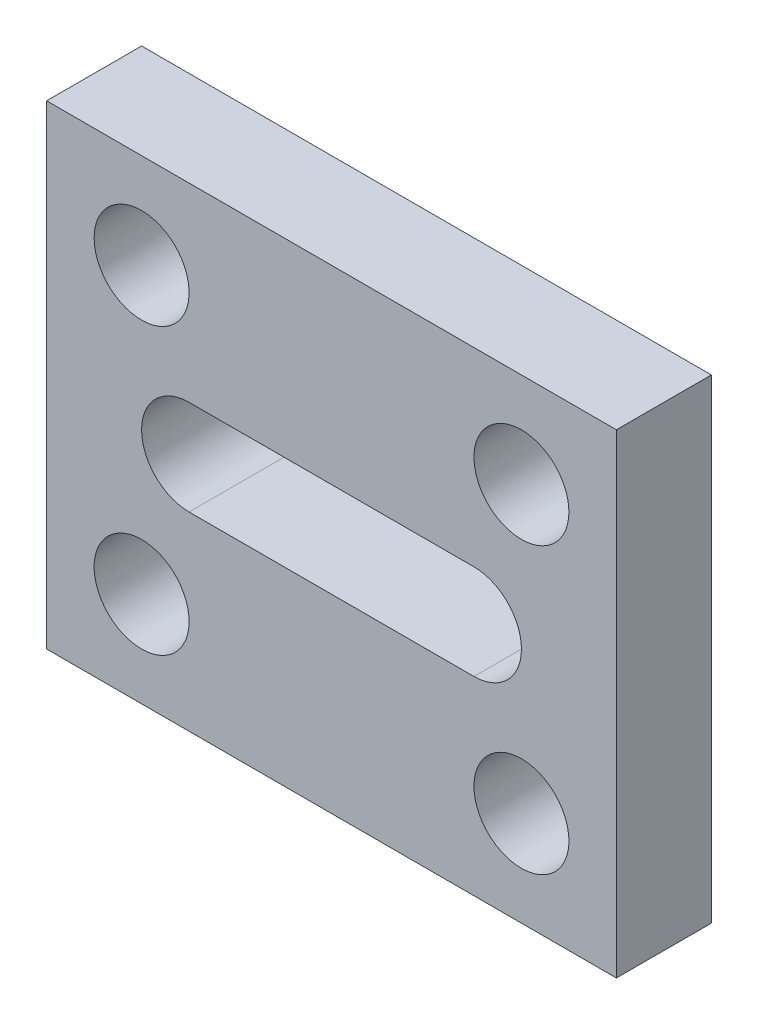
ISO-10303-21;
HEADER;
FILE_DESCRIPTION(('STEP AP214'),'2;1');
FILE_NAME('part.step','',(''),(''),'','','');
FILE_SCHEMA(('AUTOMOTIVE_DESIGN { 1 0 10303 214 1 1 1 1 }'));
ENDSEC;
DATA;
#1=APPLICATION_CONTEXT('core data for automotive mechanical design processes');
#2=APPLICATION_PROTOCOL_DEFINITION('international standard','automotive_design',2000,#1);
#3=PRODUCT_CONTEXT('',#1,'mechanical');
#4=PRODUCT('Part','Part','',(#3));
#5=PRODUCT_RELATED_PRODUCT_CATEGORY('part','',(#4));
#6=PRODUCT_DEFINITION_FORMATION('','',#4);
#7=PRODUCT_DEFINITION_CONTEXT('part definition',#1,'design');
#8=PRODUCT_DEFINITION('design','',#6,#7);
#9=PRODUCT_DEFINITION_SHAPE('','',#8);
#10=(LENGTH_UNIT() NAMED_UNIT(*) SI_UNIT(.MILLI.,.METRE.));
#11=(NAMED_UNIT(*) PLANE_ANGLE_UNIT() SI_UNIT($,.RADIAN.));
#12=(NAMED_UNIT(*) SI_UNIT($,.STERADIAN.) SOLID_ANGLE_UNIT());
#13=UNCERTAINTY_MEASURE_WITH_UNIT(LENGTH_MEASURE(1.E-05),#10,'distance_accuracy_value','');
#14=(GEOMETRIC_REPRESENTATION_CONTEXT(3) GLOBAL_UNCERTAINTY_ASSIGNED_CONTEXT((#13)) GLOBAL_UNIT_ASSIGNED_CONTEXT((#10,
#11,#12)) REPRESENTATION_CONTEXT('',''));
#15=CARTESIAN_POINT('',(0.,0.,0.));
#16=DIRECTION('',(0.,0.,1.));
#17=DIRECTION('',(1.,0.,0.));
#18=AXIS2_PLACEMENT_3D('',#15,#16,#17);
#19=CARTESIAN_POINT('',(0.,0.,20.));
#20=DIRECTION('',(0.,0.,1.));
#21=DIRECTION('',(1.,0.,0.));
#22=AXIS2_PLACEMENT_3D('',#19,#20,#21);
#23=PLANE('',#22);
#24=CARTESIAN_POINT('',(40.,30.,20.));
#25=DIRECTION('',(0.,0.,1.));
#26=DIRECTION('',(1.,0.,0.));
#27=AXIS2_PLACEMENT_3D('',#24,#25,#26);
#28=CIRCLE('',#27,10.);
#29=CARTESIAN_POINT('',(50.,30.,20.));
#30=VERTEX_POINT('',#29);
#31=EDGE_CURVE('E281',#30,#30,#28,.T.);
#32=ORIENTED_EDGE('',*,*,#31,.F.);
#33=EDGE_LOOP('',(#32));
#34=FACE_BOUND('',#33,.T.);
#35=CARTESIAN_POINT('',(-40.,-30.,20.));
#36=DIRECTION('',(0.,0.,1.));
#37=DIRECTION('',(1.,0.,0.));
#38=AXIS2_PLACEMENT_3D('',#35,#36,#37);
#39=CIRCLE('',#38,10.);
#40=CARTESIAN_POINT('',(-30.,-30.,20.));
#41=VERTEX_POINT('',#40);
#42=EDGE_CURVE('E144',#41,#41,#39,.T.);
#43=ORIENTED_EDGE('',*,*,#42,.F.);
#44=EDGE_LOOP('',(#43));
#45=FACE_BOUND('',#44,.T.);
#46=DIRECTION('',(0.,-1.,0.));
#47=VECTOR('',#46,1.);
#48=CARTESIAN_POINT('',(-60.,50.,20.));
#49=LINE('',#48,#47);
#50=CARTESIAN_POINT('',(-60.,50.,20.));
#51=VERTEX_POINT('',#50);
#52=CARTESIAN_POINT('',(-60.,-50.,20.));
#53=VERTEX_POINT('',#52);
#54=EDGE_CURVE('E160',#51,#53,#49,.T.);
#55=ORIENTED_EDGE('',*,*,#54,.T.);
#56=DIRECTION('',(1.,0.,0.));
#57=VECTOR('',#56,1.);
#58=CARTESIAN_POINT('',(-60.,-50.,20.));
#59=LINE('',#58,#57);
#60=CARTESIAN_POINT('',(60.,-50.,20.));
#61=VERTEX_POINT('',#60);
#62=EDGE_CURVE('E164',#53,#61,#59,.T.);
#63=ORIENTED_EDGE('',*,*,#62,.T.);
#64=DIRECTION('',(0.,1.,0.));
#65=VECTOR('',#64,1.);
#66=CARTESIAN_POINT('',(60.,50.,20.));
#67=LINE('',#66,#65);
#68=CARTESIAN_POINT('',(60.,50.,20.));
#69=VERTEX_POINT('',#68);
#70=EDGE_CURVE('E168',#61,#69,#67,.T.);
#71=ORIENTED_EDGE('',*,*,#70,.T.);
#72=DIRECTION('',(-1.,0.,0.));
#73=VECTOR('',#72,1.);
#74=CARTESIAN_POINT('',(-60.,50.,20.));
#75=LINE('',#74,#73);
#76=EDGE_CURVE('E171',#69,#51,#75,.T.);
#77=ORIENTED_EDGE('',*,*,#76,.T.);
#78=EDGE_LOOP('',(#55,#63,#71,#77));
#79=FACE_BOUND('',#78,.T.);
#80=DIRECTION('',(1.,0.,0.));
#81=VECTOR('',#80,1.);
#82=CARTESIAN_POINT('',(-30.,-10.,20.));
#83=LINE('',#82,#81);
#84=CARTESIAN_POINT('',(-30.,-10.,20.));
#85=VERTEX_POINT('',#84);
#86=CARTESIAN_POINT('',(30.,-10.,20.));
#87=VERTEX_POINT('',#86);
#88=EDGE_CURVE('E118',#85,#87,#83,.T.);
#89=ORIENTED_EDGE('',*,*,#88,.F.);
#90=CARTESIAN_POINT('',(-30.,0.,20.));
#91=DIRECTION('',(0.,0.,1.));
#92=DIRECTION('',(1.,0.,0.));
#93=AXIS2_PLACEMENT_3D('',#90,#91,#92);
#94=CIRCLE('',#93,10.);
#95=CARTESIAN_POINT('',(-30.,10.,20.));
#96=VERTEX_POINT('',#95);
#97=EDGE_CURVE('E109',#96,#85,#94,.T.);
#98=ORIENTED_EDGE('',*,*,#97,.F.);
#99=DIRECTION('',(-1.,0.,0.));
#100=VECTOR('',#99,1.);
#101=CARTESIAN_POINT('',(-30.,10.,20.));
#102=LINE('',#101,#100);
#103=CARTESIAN_POINT('',(30.,10.,20.));
#104=VERTEX_POINT('',#103);
#105=EDGE_CURVE('E136',#104,#96,#102,.T.);
#106=ORIENTED_EDGE('',*,*,#105,.F.);
#107=CARTESIAN_POINT('',(30.,0.,20.));
#108=DIRECTION('',(0.,0.,1.));
#109=DIRECTION('',(1.,0.,0.));
#110=AXIS2_PLACEMENT_3D('',#107,#108,#109);
#111=CIRCLE('',#110,10.);
#112=EDGE_CURVE('E132',#87,#104,#111,.T.);
#113=ORIENTED_EDGE('',*,*,#112,.F.);
#114=EDGE_LOOP('',(#89,#98,#106,#113));
#115=FACE_BOUND('',#114,.T.);
#116=CARTESIAN_POINT('',(40.,-30.,20.));
#117=DIRECTION('',(0.,0.,1.));
#118=DIRECTION('',(-1.,0.,0.));
#119=AXIS2_PLACEMENT_3D('',#116,#117,#118);
#120=CIRCLE('',#119,10.);
#121=CARTESIAN_POINT('',(30.,-30.,20.));
#122=VERTEX_POINT('',#121);
#123=EDGE_CURVE('E289',#122,#122,#120,.T.);
#124=ORIENTED_EDGE('',*,*,#123,.F.);
#125=EDGE_LOOP('',(#124));
#126=FACE_BOUND('',#125,.T.);
#127=CARTESIAN_POINT('',(-40.,30.,20.));
#128=DIRECTION('',(0.,0.,1.));
#129=DIRECTION('',(-1.,0.,0.));
#130=AXIS2_PLACEMENT_3D('',#127,#128,#129);
#131=CIRCLE('',#130,10.);
#132=CARTESIAN_POINT('',(-50.,30.,20.));
#133=VERTEX_POINT('',#132);
#134=EDGE_CURVE('E270',#133,#133,#131,.T.);
#135=ORIENTED_EDGE('',*,*,#134,.F.);
#136=EDGE_LOOP('',(#135));
#137=FACE_BOUND('',#136,.T.);
#138=ADVANCED_FACE('F43',(#34,#45,#79,#115,#126,#137),#23,.T.);
#139=CARTESIAN_POINT('',(0.,0.,0.));
#140=DIRECTION('',(0.,0.,1.));
#141=DIRECTION('',(1.,0.,0.));
#142=AXIS2_PLACEMENT_3D('',#139,#140,#141);
#143=PLANE('',#142);
#144=DIRECTION('',(0.,-1.,0.));
#145=VECTOR('',#144,1.);
#146=CARTESIAN_POINT('',(-60.,50.,0.));
#147=LINE('',#146,#145);
#148=CARTESIAN_POINT('',(-60.,50.,0.));
#149=VERTEX_POINT('',#148);
#150=CARTESIAN_POINT('',(-60.,-50.,0.));
#151=VERTEX_POINT('',#150);
#152=EDGE_CURVE('E127',#149,#151,#147,.T.);
#153=ORIENTED_EDGE('',*,*,#152,.F.);
#154=DIRECTION('',(-1.,0.,0.));
#155=VECTOR('',#154,1.);
#156=CARTESIAN_POINT('',(-60.,50.,0.));
#157=LINE('',#156,#155);
#158=CARTESIAN_POINT('',(60.,50.,0.));
#159=VERTEX_POINT('',#158);
#160=EDGE_CURVE('E165',#159,#149,#157,.T.);
#161=ORIENTED_EDGE('',*,*,#160,.F.);
#162=DIRECTION('',(0.,1.,0.));
#163=VECTOR('',#162,1.);
#164=CARTESIAN_POINT('',(60.,50.,0.));
#165=LINE('',#164,#163);
#166=CARTESIAN_POINT('',(60.,-50.,0.));
#167=VERTEX_POINT('',#166);
#168=EDGE_CURVE('E181',#167,#159,#165,.T.);
#169=ORIENTED_EDGE('',*,*,#168,.F.);
#170=DIRECTION('',(1.,0.,0.));
#171=VECTOR('',#170,1.);
#172=CARTESIAN_POINT('',(-60.,-50.,0.));
#173=LINE('',#172,#171);
#174=EDGE_CURVE('E178',#151,#167,#173,.T.);
#175=ORIENTED_EDGE('',*,*,#174,.F.);
#176=EDGE_LOOP('',(#153,#161,#169,#175));
#177=FACE_BOUND('',#176,.T.);
#178=CARTESIAN_POINT('',(-30.,0.,0.));
#179=DIRECTION('',(0.,0.,1.));
#180=DIRECTION('',(1.,0.,0.));
#181=AXIS2_PLACEMENT_3D('',#178,#179,#180);
#182=CIRCLE('',#181,10.);
#183=CARTESIAN_POINT('',(-30.,10.,0.));
#184=VERTEX_POINT('',#183);
#185=CARTESIAN_POINT('',(-30.,-10.,0.));
#186=VERTEX_POINT('',#185);
#187=EDGE_CURVE('E67',#184,#186,#182,.T.);
#188=ORIENTED_EDGE('',*,*,#187,.T.);
#189=DIRECTION('',(1.,0.,0.));
#190=VECTOR('',#189,1.);
#191=CARTESIAN_POINT('',(-30.,-10.,0.));
#192=LINE('',#191,#190);
#193=CARTESIAN_POINT('',(30.,-10.,0.));
#194=VERTEX_POINT('',#193);
#195=EDGE_CURVE('E125',#186,#194,#192,.T.);
#196=ORIENTED_EDGE('',*,*,#195,.T.);
#197=CARTESIAN_POINT('',(30.,0.,0.));
#198=DIRECTION('',(0.,0.,1.));
#199=DIRECTION('',(1.,0.,0.));
#200=AXIS2_PLACEMENT_3D('',#197,#198,#199);
#201=CIRCLE('',#200,10.);
#202=CARTESIAN_POINT('',(30.,10.,0.));
#203=VERTEX_POINT('',#202);
#204=EDGE_CURVE('E147',#194,#203,#201,.T.);
#205=ORIENTED_EDGE('',*,*,#204,.T.);
#206=DIRECTION('',(-1.,0.,0.));
#207=VECTOR('',#206,1.);
#208=CARTESIAN_POINT('',(-30.,10.,0.));
#209=LINE('',#208,#207);
#210=EDGE_CURVE('E119',#203,#184,#209,.T.);
#211=ORIENTED_EDGE('',*,*,#210,.T.);
#212=EDGE_LOOP('',(#188,#196,#205,#211));
#213=FACE_BOUND('',#212,.T.);
#214=CARTESIAN_POINT('',(-40.,-30.,0.));
#215=DIRECTION('',(0.,0.,1.));
#216=DIRECTION('',(1.,0.,0.));
#217=AXIS2_PLACEMENT_3D('',#214,#215,#216);
#218=CIRCLE('',#217,10.);
#219=CARTESIAN_POINT('',(-30.,-30.,0.));
#220=VERTEX_POINT('',#219);
#221=EDGE_CURVE('E293',#220,#220,#218,.T.);
#222=ORIENTED_EDGE('',*,*,#221,.T.);
#223=EDGE_LOOP('',(#222));
#224=FACE_BOUND('',#223,.T.);
#225=CARTESIAN_POINT('',(40.,-30.,0.));
#226=DIRECTION('',(0.,0.,1.));
#227=DIRECTION('',(-1.,0.,0.));
#228=AXIS2_PLACEMENT_3D('',#225,#226,#227);
#229=CIRCLE('',#228,10.);
#230=CARTESIAN_POINT('',(30.,-30.,0.));
#231=VERTEX_POINT('',#230);
#232=EDGE_CURVE('E285',#231,#231,#229,.T.);
#233=ORIENTED_EDGE('',*,*,#232,.T.);
#234=EDGE_LOOP('',(#233));
#235=FACE_BOUND('',#234,.T.);
#236=CARTESIAN_POINT('',(40.,30.,0.));
#237=DIRECTION('',(0.,0.,1.));
#238=DIRECTION('',(1.,0.,0.));
#239=AXIS2_PLACEMENT_3D('',#236,#237,#238);
#240=CIRCLE('',#239,10.);
#241=CARTESIAN_POINT('',(50.,30.,0.));
#242=VERTEX_POINT('',#241);
#243=EDGE_CURVE('E278',#242,#242,#240,.T.);
#244=ORIENTED_EDGE('',*,*,#243,.T.);
#245=EDGE_LOOP('',(#244));
#246=FACE_BOUND('',#245,.T.);
#247=CARTESIAN_POINT('',(-40.,30.,0.));
#248=DIRECTION('',(0.,0.,1.));
#249=DIRECTION('',(-1.,0.,0.));
#250=AXIS2_PLACEMENT_3D('',#247,#248,#249);
#251=CIRCLE('',#250,10.);
#252=CARTESIAN_POINT('',(-50.,30.,0.));
#253=VERTEX_POINT('',#252);
#254=EDGE_CURVE('E273',#253,#253,#251,.T.);
#255=ORIENTED_EDGE('',*,*,#254,.T.);
#256=EDGE_LOOP('',(#255));
#257=FACE_BOUND('',#256,.T.);
#258=ADVANCED_FACE('F204',(#177,#213,#224,#235,#246,#257),#143,.F.);
#259=CARTESIAN_POINT('',(-60.,50.,20.));
#260=DIRECTION('',(1.,0.,0.));
#261=DIRECTION('',(0.,0.,-1.));
#262=AXIS2_PLACEMENT_3D('',#259,#260,#261);
#263=PLANE('',#262);
#264=ORIENTED_EDGE('',*,*,#152,.T.);
#265=DIRECTION('',(0.,0.,-1.));
#266=VECTOR('',#265,1.);
#267=CARTESIAN_POINT('',(-60.,-50.,20.));
#268=LINE('',#267,#266);
#269=EDGE_CURVE('E11',#53,#151,#268,.T.);
#270=ORIENTED_EDGE('',*,*,#269,.F.);
#271=ORIENTED_EDGE('',*,*,#54,.F.);
#272=DIRECTION('',(0.,0.,-1.));
#273=VECTOR('',#272,1.);
#274=CARTESIAN_POINT('',(-60.,50.,20.));
#275=LINE('',#274,#273);
#276=EDGE_CURVE('E174',#51,#149,#275,.T.);
#277=ORIENTED_EDGE('',*,*,#276,.T.);
#278=EDGE_LOOP('',(#264,#270,#271,#277));
#279=FACE_BOUND('',#278,.T.);
#280=ADVANCED_FACE('F45',(#279),#263,.F.);
#281=CARTESIAN_POINT('',(-60.,-50.,20.));
#282=DIRECTION('',(0.,1.,0.));
#283=DIRECTION('',(0.,0.,1.));
#284=AXIS2_PLACEMENT_3D('',#281,#282,#283);
#285=PLANE('',#284);
#286=ORIENTED_EDGE('',*,*,#174,.T.);
#287=DIRECTION('',(0.,0.,-1.));
#288=VECTOR('',#287,1.);
#289=CARTESIAN_POINT('',(60.,-50.,20.));
#290=LINE('',#289,#288);
#291=EDGE_CURVE('E52',#61,#167,#290,.T.);
#292=ORIENTED_EDGE('',*,*,#291,.F.);
#293=ORIENTED_EDGE('',*,*,#62,.F.);
#294=ORIENTED_EDGE('',*,*,#269,.T.);
#295=EDGE_LOOP('',(#286,#292,#293,#294));
#296=FACE_BOUND('',#295,.T.);
#297=ADVANCED_FACE('F214',(#296),#285,.F.);
#298=CARTESIAN_POINT('',(60.,50.,20.));
#299=DIRECTION('',(-1.,0.,0.));
#300=DIRECTION('',(0.,0.,1.));
#301=AXIS2_PLACEMENT_3D('',#298,#299,#300);
#302=PLANE('',#301);
#303=ORIENTED_EDGE('',*,*,#168,.T.);
#304=DIRECTION('',(0.,0.,-1.));
#305=VECTOR('',#304,1.);
#306=CARTESIAN_POINT('',(60.,50.,20.));
#307=LINE('',#306,#305);
#308=EDGE_CURVE('E189',#69,#159,#307,.T.);
#309=ORIENTED_EDGE('',*,*,#308,.F.);
#310=ORIENTED_EDGE('',*,*,#70,.F.);
#311=ORIENTED_EDGE('',*,*,#291,.T.);
#312=EDGE_LOOP('',(#303,#309,#310,#311));
#313=FACE_BOUND('',#312,.T.);
#314=ADVANCED_FACE('F198',(#313),#302,.F.);
#315=CARTESIAN_POINT('',(-60.,50.,20.));
#316=DIRECTION('',(0.,-1.,0.));
#317=DIRECTION('',(0.,0.,-1.));
#318=AXIS2_PLACEMENT_3D('',#315,#316,#317);
#319=PLANE('',#318);
#320=ORIENTED_EDGE('',*,*,#160,.T.);
#321=ORIENTED_EDGE('',*,*,#276,.F.);
#322=ORIENTED_EDGE('',*,*,#76,.F.);
#323=ORIENTED_EDGE('',*,*,#308,.T.);
#324=EDGE_LOOP('',(#320,#321,#322,#323));
#325=FACE_BOUND('',#324,.T.);
#326=ADVANCED_FACE('F208',(#325),#319,.F.);
#327=CARTESIAN_POINT('',(-30.,0.,20.));
#328=DIRECTION('',(0.,0.,-1.));
#329=DIRECTION('',(-1.,0.,0.));
#330=AXIS2_PLACEMENT_3D('',#327,#328,#329);
#331=CYLINDRICAL_SURFACE('',#330,10.);
#332=ORIENTED_EDGE('',*,*,#187,.F.);
#333=DIRECTION('',(0.,0.,-1.));
#334=VECTOR('',#333,1.);
#335=CARTESIAN_POINT('',(-30.,10.,20.));
#336=LINE('',#335,#334);
#337=EDGE_CURVE('E113',#96,#184,#336,.T.);
#338=ORIENTED_EDGE('',*,*,#337,.F.);
#339=ORIENTED_EDGE('',*,*,#97,.T.);
#340=DIRECTION('',(0.,0.,-1.));
#341=VECTOR('',#340,1.);
#342=CARTESIAN_POINT('',(-30.,-10.,20.));
#343=LINE('',#342,#341);
#344=EDGE_CURVE('E112',#85,#186,#343,.T.);
#345=ORIENTED_EDGE('',*,*,#344,.T.);
#346=EDGE_LOOP('',(#332,#338,#339,#345));
#347=FACE_BOUND('',#346,.T.);
#348=ADVANCED_FACE('F111',(#347),#331,.F.);
#349=CARTESIAN_POINT('',(-30.,-10.,20.));
#350=DIRECTION('',(0.,1.,0.));
#351=DIRECTION('',(0.,0.,1.));
#352=AXIS2_PLACEMENT_3D('',#349,#350,#351);
#353=PLANE('',#352);
#354=ORIENTED_EDGE('',*,*,#195,.F.);
#355=ORIENTED_EDGE('',*,*,#344,.F.);
#356=ORIENTED_EDGE('',*,*,#88,.T.);
#357=DIRECTION('',(0.,0.,-1.));
#358=VECTOR('',#357,1.);
#359=CARTESIAN_POINT('',(30.,-10.,20.));
#360=LINE('',#359,#358);
#361=EDGE_CURVE('E128',#87,#194,#360,.T.);
#362=ORIENTED_EDGE('',*,*,#361,.T.);
#363=EDGE_LOOP('',(#354,#355,#356,#362));
#364=FACE_BOUND('',#363,.T.);
#365=ADVANCED_FACE('F122',(#364),#353,.T.);
#366=CARTESIAN_POINT('',(30.,0.,20.));
#367=DIRECTION('',(0.,0.,-1.));
#368=DIRECTION('',(-1.,0.,0.));
#369=AXIS2_PLACEMENT_3D('',#366,#367,#368);
#370=CYLINDRICAL_SURFACE('',#369,10.);
#371=ORIENTED_EDGE('',*,*,#204,.F.);
#372=ORIENTED_EDGE('',*,*,#361,.F.);
#373=ORIENTED_EDGE('',*,*,#112,.T.);
#374=DIRECTION('',(0.,0.,-1.));
#375=VECTOR('',#374,1.);
#376=CARTESIAN_POINT('',(30.,10.,20.));
#377=LINE('',#376,#375);
#378=EDGE_CURVE('E59',#104,#203,#377,.T.);
#379=ORIENTED_EDGE('',*,*,#378,.T.);
#380=EDGE_LOOP('',(#371,#372,#373,#379));
#381=FACE_BOUND('',#380,.T.);
#382=ADVANCED_FACE('F240',(#381),#370,.F.);
#383=CARTESIAN_POINT('',(-30.,10.,20.));
#384=DIRECTION('',(0.,-1.,0.));
#385=DIRECTION('',(0.,0.,-1.));
#386=AXIS2_PLACEMENT_3D('',#383,#384,#385);
#387=PLANE('',#386);
#388=ORIENTED_EDGE('',*,*,#210,.F.);
#389=ORIENTED_EDGE('',*,*,#378,.F.);
#390=ORIENTED_EDGE('',*,*,#105,.T.);
#391=ORIENTED_EDGE('',*,*,#337,.T.);
#392=EDGE_LOOP('',(#388,#389,#390,#391));
#393=FACE_BOUND('',#392,.T.);
#394=ADVANCED_FACE('F244',(#393),#387,.T.);
#395=CARTESIAN_POINT('',(-40.,-30.,20.));
#396=DIRECTION('',(0.,0.,-1.));
#397=DIRECTION('',(-1.,0.,0.));
#398=AXIS2_PLACEMENT_3D('',#395,#396,#397);
#399=CYLINDRICAL_SURFACE('',#398,10.);
#400=ORIENTED_EDGE('',*,*,#42,.T.);
#401=EDGE_LOOP('',(#400));
#402=FACE_BOUND('',#401,.T.);
#403=ORIENTED_EDGE('',*,*,#221,.F.);
#404=EDGE_LOOP('',(#403));
#405=FACE_BOUND('',#404,.T.);
#406=ADVANCED_FACE('F250',(#402,#405),#399,.F.);
#407=CARTESIAN_POINT('',(40.,-30.,20.));
#408=DIRECTION('',(0.,0.,-1.));
#409=DIRECTION('',(-1.,0.,0.));
#410=AXIS2_PLACEMENT_3D('',#407,#408,#409);
#411=CYLINDRICAL_SURFACE('',#410,10.);
#412=ORIENTED_EDGE('',*,*,#123,.T.);
#413=EDGE_LOOP('',(#412));
#414=FACE_BOUND('',#413,.T.);
#415=ORIENTED_EDGE('',*,*,#232,.F.);
#416=EDGE_LOOP('',(#415));
#417=FACE_BOUND('',#416,.T.);
#418=ADVANCED_FACE('F253',(#414,#417),#411,.F.);
#419=CARTESIAN_POINT('',(40.,30.,20.));
#420=DIRECTION('',(0.,0.,-1.));
#421=DIRECTION('',(-1.,0.,0.));
#422=AXIS2_PLACEMENT_3D('',#419,#420,#421);
#423=CYLINDRICAL_SURFACE('',#422,10.);
#424=ORIENTED_EDGE('',*,*,#31,.T.);
#425=EDGE_LOOP('',(#424));
#426=FACE_BOUND('',#425,.T.);
#427=ORIENTED_EDGE('',*,*,#243,.F.);
#428=EDGE_LOOP('',(#427));
#429=FACE_BOUND('',#428,.T.);
#430=ADVANCED_FACE('F257',(#426,#429),#423,.F.);
#431=CARTESIAN_POINT('',(-40.,30.,20.));
#432=DIRECTION('',(0.,0.,-1.));
#433=DIRECTION('',(-1.,0.,0.));
#434=AXIS2_PLACEMENT_3D('',#431,#432,#433);
#435=CYLINDRICAL_SURFACE('',#434,10.);
#436=ORIENTED_EDGE('',*,*,#134,.T.);
#437=EDGE_LOOP('',(#436));
#438=FACE_BOUND('',#437,.T.);
#439=ORIENTED_EDGE('',*,*,#254,.F.);
#440=EDGE_LOOP('',(#439));
#441=FACE_BOUND('',#440,.T.);
#442=ADVANCED_FACE('F261',(#438,#441),#435,.F.);
#443=CLOSED_SHELL('',(#138,#258,#280,#297,#314,#326,#348,#365,#382,#394,#406,#418,#430,#442));
#444=MANIFOLD_SOLID_BREP('B2',#443);
#445=ADVANCED_BREP_SHAPE_REPRESENTATION('',(#18,#444),#14);
#446=SHAPE_DEFINITION_REPRESENTATION(#9,#445);
ENDSEC;
END-ISO-10303-21;
